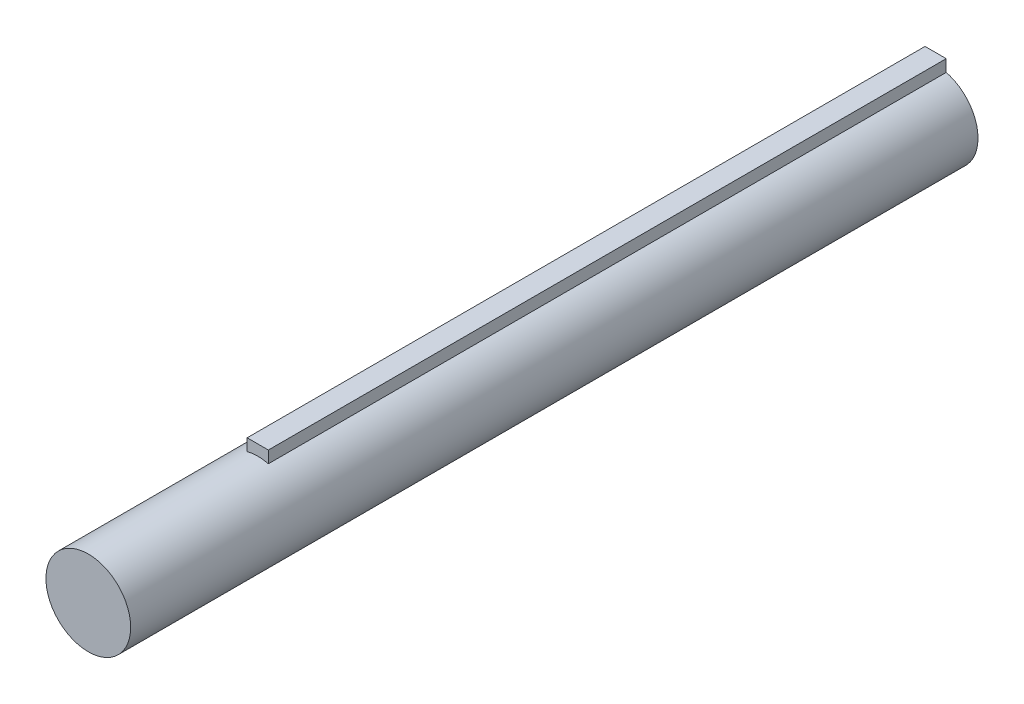
ISO-10303-21;
HEADER;
FILE_DESCRIPTION(('STEP AP214'),'2;1');
FILE_NAME('part.step','',(''),(''),'','','');
FILE_SCHEMA(('AUTOMOTIVE_DESIGN { 1 0 10303 214 1 1 1 1 }'));
ENDSEC;
DATA;
#1=APPLICATION_CONTEXT('core data for automotive mechanical design processes');
#2=APPLICATION_PROTOCOL_DEFINITION('international standard','automotive_design',2000,#1);
#3=PRODUCT_CONTEXT('',#1,'mechanical');
#4=PRODUCT('Part','Part','',(#3));
#5=PRODUCT_RELATED_PRODUCT_CATEGORY('part','',(#4));
#6=PRODUCT_DEFINITION_FORMATION('','',#4);
#7=PRODUCT_DEFINITION_CONTEXT('part definition',#1,'design');
#8=PRODUCT_DEFINITION('design','',#6,#7);
#9=PRODUCT_DEFINITION_SHAPE('','',#8);
#10=(LENGTH_UNIT() NAMED_UNIT(*) SI_UNIT(.MILLI.,.METRE.));
#11=(NAMED_UNIT(*) PLANE_ANGLE_UNIT() SI_UNIT($,.RADIAN.));
#12=(NAMED_UNIT(*) SI_UNIT($,.STERADIAN.) SOLID_ANGLE_UNIT());
#13=UNCERTAINTY_MEASURE_WITH_UNIT(LENGTH_MEASURE(1.E-05),#10,'distance_accuracy_value','');
#14=(GEOMETRIC_REPRESENTATION_CONTEXT(3) GLOBAL_UNCERTAINTY_ASSIGNED_CONTEXT((#13)) GLOBAL_UNIT_ASSIGNED_CONTEXT((#10,
#11,#12)) REPRESENTATION_CONTEXT('',''));
#15=CARTESIAN_POINT('',(0.,0.,0.));
#16=DIRECTION('',(0.,0.,1.));
#17=DIRECTION('',(1.,0.,0.));
#18=AXIS2_PLACEMENT_3D('',#15,#16,#17);
#19=CARTESIAN_POINT('',(-2.5,0.,160.));
#20=DIRECTION('',(1.,0.,0.));
#21=DIRECTION('',(0.,1.,0.));
#22=AXIS2_PLACEMENT_3D('',#19,#20,#21);
#23=PLANE('',#22);
#24=DIRECTION('',(0.,-1.,0.));
#25=VECTOR('',#24,1.);
#26=CARTESIAN_POINT('',(-2.5,0.,0.));
#27=LINE('',#26,#25);
#28=CARTESIAN_POINT('',(-2.5,12.5,0.));
#29=VERTEX_POINT('',#28);
#30=CARTESIAN_POINT('',(-2.5,9.68245836551854,0.));
#31=VERTEX_POINT('',#30);
#32=EDGE_CURVE('E113',#29,#31,#27,.T.);
#33=ORIENTED_EDGE('',*,*,#32,.T.);
#34=DIRECTION('',(0.,0.,-1.));
#35=VECTOR('',#34,1.);
#36=CARTESIAN_POINT('',(-2.5,9.68245836551854,160.));
#37=LINE('',#36,#35);
#38=CARTESIAN_POINT('',(-2.5,9.68245836551854,160.));
#39=VERTEX_POINT('',#38);
#40=EDGE_CURVE('E12',#39,#31,#37,.T.);
#41=ORIENTED_EDGE('',*,*,#40,.F.);
#42=DIRECTION('',(0.,-1.,0.));
#43=VECTOR('',#42,1.);
#44=CARTESIAN_POINT('',(-2.5,0.,160.));
#45=LINE('',#44,#43);
#46=CARTESIAN_POINT('',(-2.5,12.5,160.));
#47=VERTEX_POINT('',#46);
#48=EDGE_CURVE('E106',#47,#39,#45,.T.);
#49=ORIENTED_EDGE('',*,*,#48,.F.);
#50=DIRECTION('',(0.,0.,-1.));
#51=VECTOR('',#50,1.);
#52=CARTESIAN_POINT('',(-2.5,12.5,160.));
#53=LINE('',#52,#51);
#54=EDGE_CURVE('E52',#47,#29,#53,.T.);
#55=ORIENTED_EDGE('',*,*,#54,.T.);
#56=EDGE_LOOP('',(#33,#41,#49,#55));
#57=FACE_BOUND('',#56,.T.);
#58=ADVANCED_FACE('F49',(#57),#23,.F.);
#59=CARTESIAN_POINT('',(0.,0.,160.));
#60=DIRECTION('',(0.,0.,-1.));
#61=DIRECTION('',(-1.,0.,0.));
#62=AXIS2_PLACEMENT_3D('',#59,#60,#61);
#63=CYLINDRICAL_SURFACE('',#62,10.);
#64=CARTESIAN_POINT('',(0.,0.,0.));
#65=DIRECTION('',(0.,0.,-1.));
#66=DIRECTION('',(-1.,0.,0.));
#67=AXIS2_PLACEMENT_3D('',#64,#65,#66);
#68=CIRCLE('',#67,10.);
#69=CARTESIAN_POINT('',(2.5,9.68245836551854,0.));
#70=VERTEX_POINT('',#69);
#71=EDGE_CURVE('E88',#31,#70,#68,.T.);
#72=ORIENTED_EDGE('',*,*,#71,.T.);
#73=DIRECTION('',(0.,0.,-1.));
#74=VECTOR('',#73,1.);
#75=CARTESIAN_POINT('',(2.5,9.68245836551854,160.));
#76=LINE('',#75,#74);
#77=CARTESIAN_POINT('',(2.5,9.68245836551854,160.));
#78=VERTEX_POINT('',#77);
#79=EDGE_CURVE('E58',#78,#70,#76,.T.);
#80=ORIENTED_EDGE('',*,*,#79,.F.);
#81=CARTESIAN_POINT('',(0.,0.,160.));
#82=DIRECTION('',(0.,0.,-1.));
#83=DIRECTION('',(-1.,0.,0.));
#84=AXIS2_PLACEMENT_3D('',#81,#82,#83);
#85=CIRCLE('',#84,10.);
#86=EDGE_CURVE('E66',#39,#78,#85,.T.);
#87=ORIENTED_EDGE('',*,*,#86,.F.);
#88=ORIENTED_EDGE('',*,*,#40,.T.);
#89=EDGE_LOOP('',(#72,#80,#87,#88));
#90=FACE_BOUND('',#89,.T.);
#91=ADVANCED_FACE('F122',(#90),#63,.F.);
#92=CARTESIAN_POINT('',(2.5,0.,160.));
#93=DIRECTION('',(1.,0.,0.));
#94=DIRECTION('',(0.,1.,0.));
#95=AXIS2_PLACEMENT_3D('',#92,#93,#94);
#96=PLANE('',#95);
#97=DIRECTION('',(0.,-1.,0.));
#98=VECTOR('',#97,1.);
#99=CARTESIAN_POINT('',(2.5,0.,0.));
#100=LINE('',#99,#98);
#101=CARTESIAN_POINT('',(2.5,12.5,0.));
#102=VERTEX_POINT('',#101);
#103=EDGE_CURVE('E100',#102,#70,#100,.T.);
#104=ORIENTED_EDGE('',*,*,#103,.F.);
#105=DIRECTION('',(0.,0.,-1.));
#106=VECTOR('',#105,1.);
#107=CARTESIAN_POINT('',(2.5,12.5,160.));
#108=LINE('',#107,#106);
#109=CARTESIAN_POINT('',(2.5,12.5,160.));
#110=VERTEX_POINT('',#109);
#111=EDGE_CURVE('E97',#110,#102,#108,.T.);
#112=ORIENTED_EDGE('',*,*,#111,.F.);
#113=DIRECTION('',(0.,-1.,0.));
#114=VECTOR('',#113,1.);
#115=CARTESIAN_POINT('',(2.5,0.,160.));
#116=LINE('',#115,#114);
#117=EDGE_CURVE('E99',#110,#78,#116,.T.);
#118=ORIENTED_EDGE('',*,*,#117,.T.);
#119=ORIENTED_EDGE('',*,*,#79,.T.);
#120=EDGE_LOOP('',(#104,#112,#118,#119));
#121=FACE_BOUND('',#120,.T.);
#122=ADVANCED_FACE('F98',(#121),#96,.T.);
#123=CARTESIAN_POINT('',(0.,12.5,160.));
#124=DIRECTION('',(0.,-1.,0.));
#125=DIRECTION('',(1.,0.,0.));
#126=AXIS2_PLACEMENT_3D('',#123,#124,#125);
#127=PLANE('',#126);
#128=DIRECTION('',(-1.,0.,0.));
#129=VECTOR('',#128,1.);
#130=CARTESIAN_POINT('',(0.,12.5,0.));
#131=LINE('',#130,#129);
#132=EDGE_CURVE('E116',#102,#29,#131,.T.);
#133=ORIENTED_EDGE('',*,*,#132,.T.);
#134=ORIENTED_EDGE('',*,*,#54,.F.);
#135=DIRECTION('',(-1.,0.,0.));
#136=VECTOR('',#135,1.);
#137=CARTESIAN_POINT('',(0.,12.5,160.));
#138=LINE('',#137,#136);
#139=EDGE_CURVE('E94',#110,#47,#138,.T.);
#140=ORIENTED_EDGE('',*,*,#139,.F.);
#141=ORIENTED_EDGE('',*,*,#111,.T.);
#142=EDGE_LOOP('',(#133,#134,#140,#141));
#143=FACE_BOUND('',#142,.T.);
#144=ADVANCED_FACE('F103',(#143),#127,.F.);
#145=CARTESIAN_POINT('',(0.,0.,160.));
#146=DIRECTION('',(0.,0.,-1.));
#147=DIRECTION('',(-1.,0.,0.));
#148=AXIS2_PLACEMENT_3D('',#145,#146,#147);
#149=PLANE('',#148);
#150=ORIENTED_EDGE('',*,*,#48,.T.);
#151=ORIENTED_EDGE('',*,*,#86,.T.);
#152=ORIENTED_EDGE('',*,*,#117,.F.);
#153=ORIENTED_EDGE('',*,*,#139,.T.);
#154=EDGE_LOOP('',(#150,#151,#152,#153));
#155=FACE_BOUND('',#154,.T.);
#156=ADVANCED_FACE('F108',(#155),#149,.F.);
#157=CARTESIAN_POINT('',(0.,0.,0.));
#158=DIRECTION('',(0.,0.,-1.));
#159=DIRECTION('',(-1.,0.,0.));
#160=AXIS2_PLACEMENT_3D('',#157,#158,#159);
#161=PLANE('',#160);
#162=ORIENTED_EDGE('',*,*,#32,.F.);
#163=ORIENTED_EDGE('',*,*,#132,.F.);
#164=ORIENTED_EDGE('',*,*,#103,.T.);
#165=ORIENTED_EDGE('',*,*,#71,.F.);
#166=EDGE_LOOP('',(#162,#163,#164,#165));
#167=FACE_BOUND('',#166,.T.);
#168=ADVANCED_FACE('F131',(#167),#161,.T.);
#169=CLOSED_SHELL('',(#58,#91,#122,#144,#156,#168));
#170=MANIFOLD_SOLID_BREP('B2',#169);
#171=CARTESIAN_POINT('',(0.,0.,200.));
#172=DIRECTION('',(0.,0.,-1.));
#173=DIRECTION('',(-1.,0.,0.));
#174=AXIS2_PLACEMENT_3D('',#171,#172,#173);
#175=CYLINDRICAL_SURFACE('',#174,10.);
#176=CARTESIAN_POINT('',(0.,0.,200.));
#177=DIRECTION('',(0.,0.,1.));
#178=DIRECTION('',(1.,0.,0.));
#179=AXIS2_PLACEMENT_3D('',#176,#177,#178);
#180=CIRCLE('',#179,10.);
#181=CARTESIAN_POINT('',(10.,0.,200.));
#182=VERTEX_POINT('',#181);
#183=EDGE_CURVE('E48',#182,#182,#180,.T.);
#184=ORIENTED_EDGE('',*,*,#183,.F.);
#185=EDGE_LOOP('',(#184));
#186=FACE_BOUND('',#185,.T.);
#187=CARTESIAN_POINT('',(0.,0.,0.));
#188=DIRECTION('',(0.,0.,1.));
#189=DIRECTION('',(1.,0.,0.));
#190=AXIS2_PLACEMENT_3D('',#187,#188,#189);
#191=CIRCLE('',#190,10.);
#192=CARTESIAN_POINT('',(10.,0.,0.));
#193=VERTEX_POINT('',#192);
#194=EDGE_CURVE('E179',#193,#193,#191,.T.);
#195=ORIENTED_EDGE('',*,*,#194,.T.);
#196=EDGE_LOOP('',(#195));
#197=FACE_BOUND('',#196,.T.);
#198=ADVANCED_FACE('F176',(#186,#197),#175,.T.);
#199=CARTESIAN_POINT('',(0.,0.,200.));
#200=DIRECTION('',(0.,0.,1.));
#201=DIRECTION('',(1.,0.,0.));
#202=AXIS2_PLACEMENT_3D('',#199,#200,#201);
#203=PLANE('',#202);
#204=ORIENTED_EDGE('',*,*,#183,.T.);
#205=EDGE_LOOP('',(#204));
#206=FACE_BOUND('',#205,.T.);
#207=ADVANCED_FACE('F191',(#206),#203,.T.);
#208=CARTESIAN_POINT('',(0.,0.,0.));
#209=DIRECTION('',(0.,0.,1.));
#210=DIRECTION('',(1.,0.,0.));
#211=AXIS2_PLACEMENT_3D('',#208,#209,#210);
#212=PLANE('',#211);
#213=ORIENTED_EDGE('',*,*,#194,.F.);
#214=EDGE_LOOP('',(#213));
#215=FACE_BOUND('',#214,.T.);
#216=ADVANCED_FACE('F189',(#215),#212,.F.);
#217=CLOSED_SHELL('',(#198,#207,#216));
#218=MANIFOLD_SOLID_BREP('B6',#217);
#219=ADVANCED_BREP_SHAPE_REPRESENTATION('',(#18,#170,#218),#14);
#220=SHAPE_DEFINITION_REPRESENTATION(#9,#219);
ENDSEC;
END-ISO-10303-21;
